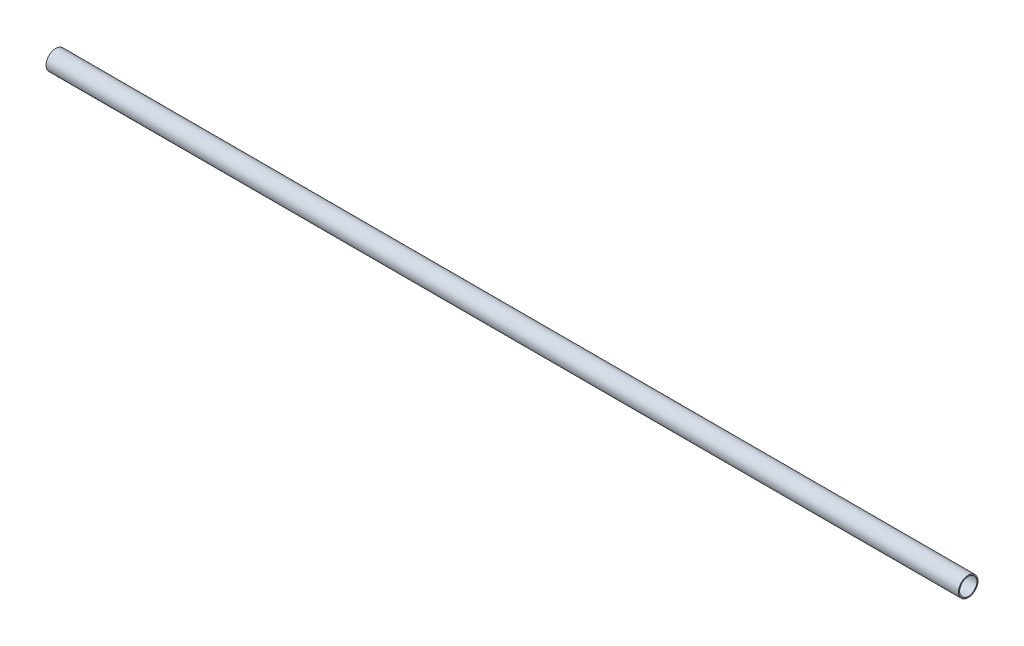
ISO-10303-21;
HEADER;
FILE_DESCRIPTION(('STEP AP214'),'2;1');
FILE_NAME('part.step','',(''),(''),'','','');
FILE_SCHEMA(('AUTOMOTIVE_DESIGN { 1 0 10303 214 1 1 1 1 }'));
ENDSEC;
DATA;
#1=APPLICATION_CONTEXT('core data for automotive mechanical design processes');
#2=APPLICATION_PROTOCOL_DEFINITION('international standard','automotive_design',2000,#1);
#3=PRODUCT_CONTEXT('',#1,'mechanical');
#4=PRODUCT('Part','Part','',(#3));
#5=PRODUCT_RELATED_PRODUCT_CATEGORY('part','',(#4));
#6=PRODUCT_DEFINITION_FORMATION('','',#4);
#7=PRODUCT_DEFINITION_CONTEXT('part definition',#1,'design');
#8=PRODUCT_DEFINITION('design','',#6,#7);
#9=PRODUCT_DEFINITION_SHAPE('','',#8);
#10=(LENGTH_UNIT() NAMED_UNIT(*) SI_UNIT(.MILLI.,.METRE.));
#11=(NAMED_UNIT(*) PLANE_ANGLE_UNIT() SI_UNIT($,.RADIAN.));
#12=(NAMED_UNIT(*) SI_UNIT($,.STERADIAN.) SOLID_ANGLE_UNIT());
#13=UNCERTAINTY_MEASURE_WITH_UNIT(LENGTH_MEASURE(1.E-05),#10,'distance_accuracy_value','');
#14=(GEOMETRIC_REPRESENTATION_CONTEXT(3) GLOBAL_UNCERTAINTY_ASSIGNED_CONTEXT((#13)) GLOBAL_UNIT_ASSIGNED_CONTEXT((#10,
#11,#12)) REPRESENTATION_CONTEXT('',''));
#15=CARTESIAN_POINT('',(0.,0.,0.));
#16=DIRECTION('',(0.,0.,1.));
#17=DIRECTION('',(1.,0.,0.));
#18=AXIS2_PLACEMENT_3D('',#15,#16,#17);
#19=CARTESIAN_POINT('',(147.32,0.,0.));
#20=DIRECTION('',(1.,0.,0.));
#21=DIRECTION('',(0.,0.,-1.));
#22=AXIS2_PLACEMENT_3D('',#19,#20,#21);
#23=PLANE('',#22);
#24=CARTESIAN_POINT('',(147.32,0.,0.));
#25=DIRECTION('',(1.,0.,0.));
#26=DIRECTION('',(0.,0.,-1.));
#27=AXIS2_PLACEMENT_3D('',#24,#25,#26);
#28=CIRCLE('',#27,1.5748);
#29=CARTESIAN_POINT('',(147.32,0.,-1.5748));
#30=VERTEX_POINT('',#29);
#31=EDGE_CURVE('E10',#30,#30,#28,.T.);
#32=ORIENTED_EDGE('',*,*,#31,.T.);
#33=EDGE_LOOP('',(#32));
#34=FACE_BOUND('',#33,.T.);
#35=CARTESIAN_POINT('',(147.32,0.,0.));
#36=DIRECTION('',(1.,0.,0.));
#37=DIRECTION('',(0.,0.,-1.));
#38=AXIS2_PLACEMENT_3D('',#35,#36,#37);
#39=CIRCLE('',#38,1.397);
#40=CARTESIAN_POINT('',(147.32,0.,-1.397));
#41=VERTEX_POINT('',#40);
#42=EDGE_CURVE('E48',#41,#41,#39,.T.);
#43=ORIENTED_EDGE('',*,*,#42,.F.);
#44=EDGE_LOOP('',(#43));
#45=FACE_BOUND('',#44,.T.);
#46=ADVANCED_FACE('F37',(#34,#45),#23,.T.);
#47=CARTESIAN_POINT('',(0.,0.,0.));
#48=DIRECTION('',(1.,0.,0.));
#49=DIRECTION('',(0.,0.,-1.));
#50=AXIS2_PLACEMENT_3D('',#47,#48,#49);
#51=PLANE('',#50);
#52=CARTESIAN_POINT('',(0.,0.,0.));
#53=DIRECTION('',(1.,0.,0.));
#54=DIRECTION('',(0.,0.,-1.));
#55=AXIS2_PLACEMENT_3D('',#52,#53,#54);
#56=CIRCLE('',#55,1.5748);
#57=CARTESIAN_POINT('',(0.,0.,-1.5748));
#58=VERTEX_POINT('',#57);
#59=EDGE_CURVE('E41',#58,#58,#56,.T.);
#60=ORIENTED_EDGE('',*,*,#59,.F.);
#61=EDGE_LOOP('',(#60));
#62=FACE_BOUND('',#61,.T.);
#63=CARTESIAN_POINT('',(0.,0.,0.));
#64=DIRECTION('',(1.,0.,0.));
#65=DIRECTION('',(0.,0.,-1.));
#66=AXIS2_PLACEMENT_3D('',#63,#64,#65);
#67=CIRCLE('',#66,1.397);
#68=CARTESIAN_POINT('',(0.,0.,-1.397));
#69=VERTEX_POINT('',#68);
#70=EDGE_CURVE('E50',#69,#69,#67,.T.);
#71=ORIENTED_EDGE('',*,*,#70,.T.);
#72=EDGE_LOOP('',(#71));
#73=FACE_BOUND('',#72,.T.);
#74=ADVANCED_FACE('F60',(#62,#73),#51,.F.);
#75=CARTESIAN_POINT('',(147.32,0.,0.));
#76=DIRECTION('',(-1.,0.,0.));
#77=DIRECTION('',(0.,0.,1.));
#78=AXIS2_PLACEMENT_3D('',#75,#76,#77);
#79=CYLINDRICAL_SURFACE('',#78,1.5748);
#80=ORIENTED_EDGE('',*,*,#31,.F.);
#81=EDGE_LOOP('',(#80));
#82=FACE_BOUND('',#81,.T.);
#83=ORIENTED_EDGE('',*,*,#59,.T.);
#84=EDGE_LOOP('',(#83));
#85=FACE_BOUND('',#84,.T.);
#86=ADVANCED_FACE('F39',(#82,#85),#79,.T.);
#87=CARTESIAN_POINT('',(147.32,0.,0.));
#88=DIRECTION('',(-1.,0.,0.));
#89=DIRECTION('',(0.,0.,1.));
#90=AXIS2_PLACEMENT_3D('',#87,#88,#89);
#91=CYLINDRICAL_SURFACE('',#90,1.397);
#92=ORIENTED_EDGE('',*,*,#42,.T.);
#93=EDGE_LOOP('',(#92));
#94=FACE_BOUND('',#93,.T.);
#95=ORIENTED_EDGE('',*,*,#70,.F.);
#96=EDGE_LOOP('',(#95));
#97=FACE_BOUND('',#96,.T.);
#98=ADVANCED_FACE('F56',(#94,#97),#91,.F.);
#99=CLOSED_SHELL('',(#46,#74,#86,#98));
#100=MANIFOLD_SOLID_BREP('B2',#99);
#101=ADVANCED_BREP_SHAPE_REPRESENTATION('',(#18,#100),#14);
#102=SHAPE_DEFINITION_REPRESENTATION(#9,#101);
ENDSEC;
END-ISO-10303-21;
